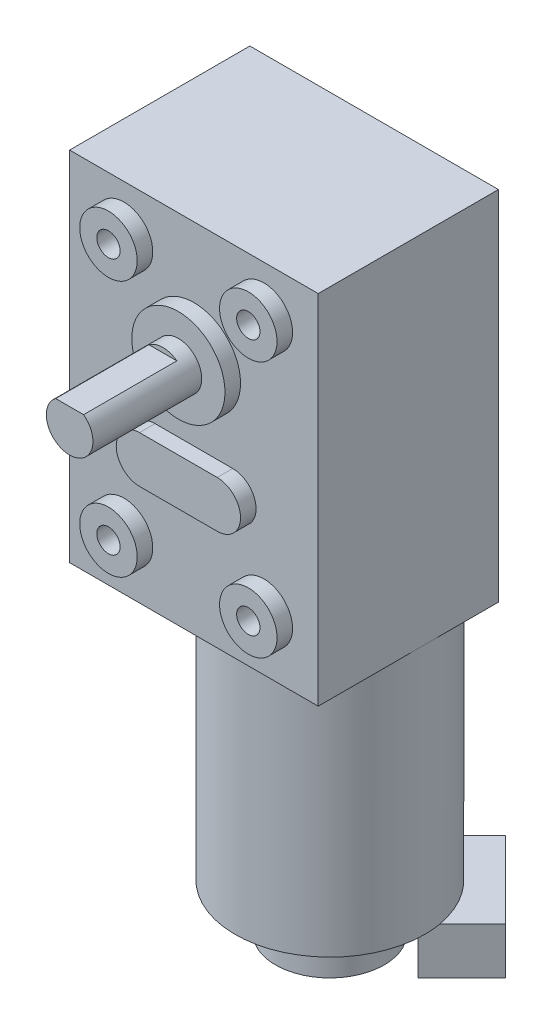
ISO-10303-21;
HEADER;
FILE_DESCRIPTION(('STEP AP214'),'2;1');
FILE_NAME('part.step','',(''),(''),'','','');
FILE_SCHEMA(('AUTOMOTIVE_DESIGN { 1 0 10303 214 1 1 1 1 }'));
ENDSEC;
DATA;
#1=APPLICATION_CONTEXT('core data for automotive mechanical design processes');
#2=APPLICATION_PROTOCOL_DEFINITION('international standard','automotive_design',2000,#1);
#3=PRODUCT_CONTEXT('',#1,'mechanical');
#4=PRODUCT('Part','Part','',(#3));
#5=PRODUCT_RELATED_PRODUCT_CATEGORY('part','',(#4));
#6=PRODUCT_DEFINITION_FORMATION('','',#4);
#7=PRODUCT_DEFINITION_CONTEXT('part definition',#1,'design');
#8=PRODUCT_DEFINITION('design','',#6,#7);
#9=PRODUCT_DEFINITION_SHAPE('','',#8);
#10=(LENGTH_UNIT() NAMED_UNIT(*) SI_UNIT(.MILLI.,.METRE.));
#11=(NAMED_UNIT(*) PLANE_ANGLE_UNIT() SI_UNIT($,.RADIAN.));
#12=(NAMED_UNIT(*) SI_UNIT($,.STERADIAN.) SOLID_ANGLE_UNIT());
#13=UNCERTAINTY_MEASURE_WITH_UNIT(LENGTH_MEASURE(1.E-05),#10,'distance_accuracy_value','');
#14=(GEOMETRIC_REPRESENTATION_CONTEXT(3) GLOBAL_UNCERTAINTY_ASSIGNED_CONTEXT((#13)) GLOBAL_UNIT_ASSIGNED_CONTEXT((#10,
#11,#12)) REPRESENTATION_CONTEXT('',''));
#15=CARTESIAN_POINT('',(0.,0.,0.));
#16=DIRECTION('',(0.,0.,1.));
#17=DIRECTION('',(1.,0.,0.));
#18=AXIS2_PLACEMENT_3D('',#15,#16,#17);
#19=CARTESIAN_POINT('',(3.80000000000001,-63.3,9.5));
#20=DIRECTION('',(0.,-1.,0.));
#21=DIRECTION('',(0.,0.,-1.));
#22=AXIS2_PLACEMENT_3D('',#19,#20,#21);
#23=PLANE('',#22);
#24=CARTESIAN_POINT('',(3.80000000000001,-63.3,9.5));
#25=DIRECTION('',(0.,-1.,0.));
#26=DIRECTION('',(0.,0.,-1.));
#27=AXIS2_PLACEMENT_3D('',#24,#25,#26);
#28=CIRCLE('',#27,7.);
#29=CARTESIAN_POINT('',(3.80000000000001,-63.3,2.5));
#30=VERTEX_POINT('',#29);
#31=EDGE_CURVE('E177',#30,#30,#28,.T.);
#32=ORIENTED_EDGE('',*,*,#31,.F.);
#33=EDGE_LOOP('',(#32));
#34=FACE_BOUND('',#33,.T.);
#35=CARTESIAN_POINT('',(3.80000000000001,-63.3,9.5));
#36=DIRECTION('',(0.,-1.,0.));
#37=DIRECTION('',(0.,0.,-1.));
#38=AXIS2_PLACEMENT_3D('',#35,#36,#37);
#39=CIRCLE('',#38,12.2);
#40=CARTESIAN_POINT('',(15.8151561613681,-63.3,7.38433877524353));
#41=VERTEX_POINT('',#40);
#42=CARTESIAN_POINT('',(5.91566122475643,-63.3,-2.51515616136811));
#43=VERTEX_POINT('',#42);
#44=EDGE_CURVE('E187',#41,#43,#39,.T.);
#45=ORIENTED_EDGE('',*,*,#44,.T.);
#46=DIRECTION('',(0.707106781186546,0.,-0.707106781186549));
#47=VECTOR('',#46,1.);
#48=CARTESIAN_POINT('',(4.50710678118654,-63.3,-1.10660171779822));
#49=LINE('',#48,#47);
#50=CARTESIAN_POINT('',(4.50710678118654,-63.3,-1.10660171779822));
#51=VERTEX_POINT('',#50);
#52=EDGE_CURVE('E793',#51,#43,#49,.T.);
#53=ORIENTED_EDGE('',*,*,#52,.F.);
#54=DIRECTION('',(-0.707106781186549,0.,-0.707106781186546));
#55=VECTOR('',#54,1.);
#56=CARTESIAN_POINT('',(14.4066017177982,-63.3,8.79289321881343));
#57=LINE('',#56,#55);
#58=CARTESIAN_POINT('',(14.4066017177982,-63.3,8.79289321881343));
#59=VERTEX_POINT('',#58);
#60=EDGE_CURVE('E175',#59,#51,#57,.T.);
#61=ORIENTED_EDGE('',*,*,#60,.F.);
#62=DIRECTION('',(0.707106781186546,0.,-0.707106781186549));
#63=VECTOR('',#62,1.);
#64=CARTESIAN_POINT('',(8.74974746830585,-63.3,14.4497474683058));
#65=LINE('',#64,#63);
#66=EDGE_CURVE('E11',#59,#41,#65,.T.);
#67=ORIENTED_EDGE('',*,*,#66,.T.);
#68=EDGE_LOOP('',(#45,#53,#61,#67));
#69=FACE_BOUND('',#68,.T.);
#70=ADVANCED_FACE('F34',(#34,#69),#23,.T.);
#71=CARTESIAN_POINT('',(0.,0.,23.2));
#72=DIRECTION('',(0.,0.,1.));
#73=DIRECTION('',(1.,0.,0.));
#74=AXIS2_PLACEMENT_3D('',#71,#72,#73);
#75=PLANE('',#74);
#76=CARTESIAN_POINT('',(0.,0.,23.2));
#77=DIRECTION('',(0.,0.,1.));
#78=DIRECTION('',(1.,0.,0.));
#79=AXIS2_PLACEMENT_3D('',#76,#77,#78);
#80=CIRCLE('',#79,6.);
#81=CARTESIAN_POINT('',(6.,0.,23.2));
#82=VERTEX_POINT('',#81);
#83=EDGE_CURVE('E261',#82,#82,#80,.T.);
#84=ORIENTED_EDGE('',*,*,#83,.F.);
#85=EDGE_LOOP('',(#84));
#86=FACE_BOUND('',#85,.T.);
#87=CARTESIAN_POINT('',(-8.99999999999999,-24.,23.2));
#88=DIRECTION('',(0.,0.,1.));
#89=DIRECTION('',(1.,0.,0.));
#90=AXIS2_PLACEMENT_3D('',#87,#88,#89);
#91=CIRCLE('',#90,3.7);
#92=CARTESIAN_POINT('',(-5.29999999999999,-24.,23.2));
#93=VERTEX_POINT('',#92);
#94=EDGE_CURVE('E265',#93,#93,#91,.T.);
#95=ORIENTED_EDGE('',*,*,#94,.F.);
#96=EDGE_LOOP('',(#95));
#97=FACE_BOUND('',#96,.T.);
#98=CARTESIAN_POINT('',(9.00000000000001,-24.,23.2));
#99=DIRECTION('',(0.,0.,1.));
#100=DIRECTION('',(1.,0.,0.));
#101=AXIS2_PLACEMENT_3D('',#98,#99,#100);
#102=CIRCLE('',#101,3.7);
#103=CARTESIAN_POINT('',(12.7,-24.,23.2));
#104=VERTEX_POINT('',#103);
#105=EDGE_CURVE('E271',#104,#104,#102,.T.);
#106=ORIENTED_EDGE('',*,*,#105,.F.);
#107=EDGE_LOOP('',(#106));
#108=FACE_BOUND('',#107,.T.);
#109=CARTESIAN_POINT('',(9.,9.,23.2));
#110=DIRECTION('',(0.,0.,1.));
#111=DIRECTION('',(1.,0.,0.));
#112=AXIS2_PLACEMENT_3D('',#109,#110,#111);
#113=CIRCLE('',#112,3.7);
#114=CARTESIAN_POINT('',(12.7,9.,23.2));
#115=VERTEX_POINT('',#114);
#116=EDGE_CURVE('E277',#115,#115,#113,.T.);
#117=ORIENTED_EDGE('',*,*,#116,.F.);
#118=EDGE_LOOP('',(#117));
#119=FACE_BOUND('',#118,.T.);
#120=CARTESIAN_POINT('',(-9.,9.,23.2));
#121=DIRECTION('',(0.,0.,1.));
#122=DIRECTION('',(1.,0.,0.));
#123=AXIS2_PLACEMENT_3D('',#120,#121,#122);
#124=CIRCLE('',#123,3.7);
#125=CARTESIAN_POINT('',(-5.3,9.,23.2));
#126=VERTEX_POINT('',#125);
#127=EDGE_CURVE('E283',#126,#126,#124,.T.);
#128=ORIENTED_EDGE('',*,*,#127,.F.);
#129=EDGE_LOOP('',(#128));
#130=FACE_BOUND('',#129,.T.);
#131=DIRECTION('',(0.,-1.,0.));
#132=VECTOR('',#131,1.);
#133=CARTESIAN_POINT('',(-16.,15.,23.2));
#134=LINE('',#133,#132);
#135=CARTESIAN_POINT('',(-16.,15.,23.2));
#136=VERTEX_POINT('',#135);
#137=CARTESIAN_POINT('',(-16.,-31.,23.2));
#138=VERTEX_POINT('',#137);
#139=EDGE_CURVE('E296',#136,#138,#134,.T.);
#140=ORIENTED_EDGE('',*,*,#139,.T.);
#141=DIRECTION('',(1.,0.,0.));
#142=VECTOR('',#141,1.);
#143=CARTESIAN_POINT('',(-16.,-31.,23.2));
#144=LINE('',#143,#142);
#145=CARTESIAN_POINT('',(16.,-31.,23.2));
#146=VERTEX_POINT('',#145);
#147=EDGE_CURVE('E299',#138,#146,#144,.T.);
#148=ORIENTED_EDGE('',*,*,#147,.T.);
#149=DIRECTION('',(0.,1.,0.));
#150=VECTOR('',#149,1.);
#151=CARTESIAN_POINT('',(16.,15.,23.2));
#152=LINE('',#151,#150);
#153=CARTESIAN_POINT('',(16.,15.,23.2));
#154=VERTEX_POINT('',#153);
#155=EDGE_CURVE('E302',#146,#154,#152,.T.);
#156=ORIENTED_EDGE('',*,*,#155,.T.);
#157=DIRECTION('',(-1.,0.,0.));
#158=VECTOR('',#157,1.);
#159=CARTESIAN_POINT('',(-16.,15.,23.2));
#160=LINE('',#159,#158);
#161=EDGE_CURVE('E304',#154,#136,#160,.T.);
#162=ORIENTED_EDGE('',*,*,#161,.T.);
#163=EDGE_LOOP('',(#140,#148,#156,#162));
#164=FACE_BOUND('',#163,.T.);
#165=DIRECTION('',(1.,0.,0.));
#166=VECTOR('',#165,1.);
#167=CARTESIAN_POINT('',(-5.00000000000001,-16.,23.2));
#168=LINE('',#167,#166);
#169=CARTESIAN_POINT('',(-5.00000000000001,-16.,23.2));
#170=VERTEX_POINT('',#169);
#171=CARTESIAN_POINT('',(4.99999999999999,-16.,23.2));
#172=VERTEX_POINT('',#171);
#173=EDGE_CURVE('E246',#170,#172,#168,.T.);
#174=ORIENTED_EDGE('',*,*,#173,.F.);
#175=CARTESIAN_POINT('',(-5.00000000000001,-13.,23.2));
#176=DIRECTION('',(0.,0.,1.));
#177=DIRECTION('',(1.,0.,0.));
#178=AXIS2_PLACEMENT_3D('',#175,#176,#177);
#179=CIRCLE('',#178,3.);
#180=CARTESIAN_POINT('',(-5.00000000000001,-10.,23.2));
#181=VERTEX_POINT('',#180);
#182=EDGE_CURVE('E230',#181,#170,#179,.T.);
#183=ORIENTED_EDGE('',*,*,#182,.F.);
#184=DIRECTION('',(-1.,0.,0.));
#185=VECTOR('',#184,1.);
#186=CARTESIAN_POINT('',(-5.00000000000001,-10.,23.2));
#187=LINE('',#186,#185);
#188=CARTESIAN_POINT('',(4.99999999999999,-10.,23.2));
#189=VERTEX_POINT('',#188);
#190=EDGE_CURVE('E237',#189,#181,#187,.T.);
#191=ORIENTED_EDGE('',*,*,#190,.F.);
#192=CARTESIAN_POINT('',(4.99999999999999,-13.,23.2));
#193=DIRECTION('',(0.,0.,1.));
#194=DIRECTION('',(1.,0.,0.));
#195=AXIS2_PLACEMENT_3D('',#192,#193,#194);
#196=CIRCLE('',#195,3.);
#197=EDGE_CURVE('E248',#172,#189,#196,.T.);
#198=ORIENTED_EDGE('',*,*,#197,.F.);
#199=EDGE_LOOP('',(#174,#183,#191,#198));
#200=FACE_BOUND('',#199,.T.);
#201=ADVANCED_FACE('F358',(#86,#97,#108,#119,#130,#164,#200),#75,.T.);
#202=CARTESIAN_POINT('',(-16.,-31.,23.2));
#203=DIRECTION('',(0.,1.,0.));
#204=DIRECTION('',(0.,0.,1.));
#205=AXIS2_PLACEMENT_3D('',#202,#203,#204);
#206=PLANE('',#205);
#207=CARTESIAN_POINT('',(3.80000000000001,-31.,9.5));
#208=DIRECTION('',(0.,-1.,0.));
#209=DIRECTION('',(0.,0.,-1.));
#210=AXIS2_PLACEMENT_3D('',#207,#208,#209);
#211=CIRCLE('',#210,12.2);
#212=CARTESIAN_POINT('',(11.4544104933039,-31.,0.));
#213=VERTEX_POINT('',#212);
#214=CARTESIAN_POINT('',(16.,-31.,9.5));
#215=VERTEX_POINT('',#214);
#216=EDGE_CURVE('E292',#213,#215,#211,.T.);
#217=ORIENTED_EDGE('',*,*,#216,.F.);
#218=DIRECTION('',(1.,0.,0.));
#219=VECTOR('',#218,1.);
#220=CARTESIAN_POINT('',(-16.,-31.,0.));
#221=LINE('',#220,#219);
#222=CARTESIAN_POINT('',(16.,-31.,0.));
#223=VERTEX_POINT('',#222);
#224=EDGE_CURVE('E309',#213,#223,#221,.T.);
#225=ORIENTED_EDGE('',*,*,#224,.T.);
#226=DIRECTION('',(0.,0.,-1.));
#227=VECTOR('',#226,1.);
#228=CARTESIAN_POINT('',(16.,-31.,23.2));
#229=LINE('',#228,#227);
#230=EDGE_CURVE('E321',#215,#223,#229,.T.);
#231=ORIENTED_EDGE('',*,*,#230,.F.);
#232=EDGE_LOOP('',(#217,#225,#231));
#233=FACE_BOUND('',#232,.T.);
#234=ADVANCED_FACE('F344',(#233),#206,.F.);
#235=CARTESIAN_POINT('',(-16.,15.,23.2));
#236=DIRECTION('',(1.,0.,0.));
#237=DIRECTION('',(0.,0.,-1.));
#238=AXIS2_PLACEMENT_3D('',#235,#236,#237);
#239=PLANE('',#238);
#240=DIRECTION('',(0.,-1.,0.));
#241=VECTOR('',#240,1.);
#242=CARTESIAN_POINT('',(-16.,15.,0.));
#243=LINE('',#242,#241);
#244=CARTESIAN_POINT('',(-16.,15.,0.));
#245=VERTEX_POINT('',#244);
#246=CARTESIAN_POINT('',(-16.,-31.,0.));
#247=VERTEX_POINT('',#246);
#248=EDGE_CURVE('E295',#245,#247,#243,.T.);
#249=ORIENTED_EDGE('',*,*,#248,.T.);
#250=DIRECTION('',(0.,0.,-1.));
#251=VECTOR('',#250,1.);
#252=CARTESIAN_POINT('',(-16.,-31.,23.2));
#253=LINE('',#252,#251);
#254=EDGE_CURVE('E324',#138,#247,#253,.T.);
#255=ORIENTED_EDGE('',*,*,#254,.F.);
#256=ORIENTED_EDGE('',*,*,#139,.F.);
#257=DIRECTION('',(0.,0.,-1.));
#258=VECTOR('',#257,1.);
#259=CARTESIAN_POINT('',(-16.,15.,23.2));
#260=LINE('',#259,#258);
#261=EDGE_CURVE('E306',#136,#245,#260,.T.);
#262=ORIENTED_EDGE('',*,*,#261,.T.);
#263=EDGE_LOOP('',(#249,#255,#256,#262));
#264=FACE_BOUND('',#263,.T.);
#265=ADVANCED_FACE('F36',(#264),#239,.F.);
#266=CARTESIAN_POINT('',(-3.85441049330383,-31.,0.));
#267=VERTEX_POINT('',#266);
#268=EDGE_CURVE('E42',#215,#267,#211,.T.);
#269=ORIENTED_EDGE('',*,*,#268,.F.);
#270=EDGE_CURVE('E322',#146,#215,#229,.T.);
#271=ORIENTED_EDGE('',*,*,#270,.F.);
#272=ORIENTED_EDGE('',*,*,#147,.F.);
#273=ORIENTED_EDGE('',*,*,#254,.T.);
#274=EDGE_CURVE('E310',#247,#267,#221,.T.);
#275=ORIENTED_EDGE('',*,*,#274,.T.);
#276=EDGE_LOOP('',(#269,#271,#272,#273,#275));
#277=FACE_BOUND('',#276,.T.);
#278=ADVANCED_FACE('F361',(#277),#206,.F.);
#279=CARTESIAN_POINT('',(16.,15.,23.2));
#280=DIRECTION('',(-1.,0.,0.));
#281=DIRECTION('',(0.,-1.,0.));
#282=AXIS2_PLACEMENT_3D('',#279,#280,#281);
#283=PLANE('',#282);
#284=DIRECTION('',(0.,1.,0.));
#285=VECTOR('',#284,1.);
#286=CARTESIAN_POINT('',(16.,15.,0.));
#287=LINE('',#286,#285);
#288=CARTESIAN_POINT('',(16.,15.,0.));
#289=VERTEX_POINT('',#288);
#290=EDGE_CURVE('E312',#223,#289,#287,.T.);
#291=ORIENTED_EDGE('',*,*,#290,.T.);
#292=DIRECTION('',(0.,0.,-1.));
#293=VECTOR('',#292,1.);
#294=CARTESIAN_POINT('',(16.,15.,23.2));
#295=LINE('',#294,#293);
#296=EDGE_CURVE('E318',#154,#289,#295,.T.);
#297=ORIENTED_EDGE('',*,*,#296,.F.);
#298=ORIENTED_EDGE('',*,*,#155,.F.);
#299=ORIENTED_EDGE('',*,*,#270,.T.);
#300=ORIENTED_EDGE('',*,*,#230,.T.);
#301=EDGE_LOOP('',(#291,#297,#298,#299,#300));
#302=FACE_BOUND('',#301,.T.);
#303=ADVANCED_FACE('F350',(#302),#283,.F.);
#304=CARTESIAN_POINT('',(-16.,15.,23.2));
#305=DIRECTION('',(0.,-1.,0.));
#306=DIRECTION('',(1.,0.,0.));
#307=AXIS2_PLACEMENT_3D('',#304,#305,#306);
#308=PLANE('',#307);
#309=DIRECTION('',(-1.,0.,0.));
#310=VECTOR('',#309,1.);
#311=CARTESIAN_POINT('',(-16.,15.,0.));
#312=LINE('',#311,#310);
#313=EDGE_CURVE('E300',#289,#245,#312,.T.);
#314=ORIENTED_EDGE('',*,*,#313,.T.);
#315=ORIENTED_EDGE('',*,*,#261,.F.);
#316=ORIENTED_EDGE('',*,*,#161,.F.);
#317=ORIENTED_EDGE('',*,*,#296,.T.);
#318=EDGE_LOOP('',(#314,#315,#316,#317));
#319=FACE_BOUND('',#318,.T.);
#320=ADVANCED_FACE('F354',(#319),#308,.F.);
#321=CARTESIAN_POINT('',(0.,0.,0.));
#322=DIRECTION('',(0.,0.,1.));
#323=DIRECTION('',(1.,0.,0.));
#324=AXIS2_PLACEMENT_3D('',#321,#322,#323);
#325=PLANE('',#324);
#326=ORIENTED_EDGE('',*,*,#248,.F.);
#327=ORIENTED_EDGE('',*,*,#313,.F.);
#328=ORIENTED_EDGE('',*,*,#290,.F.);
#329=ORIENTED_EDGE('',*,*,#224,.F.);
#330=EDGE_CURVE('E313',#267,#213,#221,.T.);
#331=ORIENTED_EDGE('',*,*,#330,.F.);
#332=ORIENTED_EDGE('',*,*,#274,.F.);
#333=EDGE_LOOP('',(#326,#327,#328,#329,#331,#332));
#334=FACE_BOUND('',#333,.T.);
#335=ADVANCED_FACE('F347',(#334),#325,.F.);
#336=CARTESIAN_POINT('',(3.80000000000001,-31.,9.5));
#337=DIRECTION('',(0.,-1.,0.));
#338=DIRECTION('',(0.,0.,-1.));
#339=AXIS2_PLACEMENT_3D('',#336,#337,#338);
#340=PLANE('',#339);
#341=EDGE_CURVE('E289',#267,#213,#211,.T.);
#342=ORIENTED_EDGE('',*,*,#341,.F.);
#343=ORIENTED_EDGE('',*,*,#330,.T.);
#344=EDGE_LOOP('',(#342,#343));
#345=FACE_BOUND('',#344,.T.);
#346=ADVANCED_FACE('F336',(#345),#340,.F.);
#347=CARTESIAN_POINT('',(3.80000000000001,-61.8,9.5));
#348=DIRECTION('',(0.,1.,0.));
#349=DIRECTION('',(0.,0.,1.));
#350=AXIS2_PLACEMENT_3D('',#347,#348,#349);
#351=CYLINDRICAL_SURFACE('',#350,12.2);
#352=ORIENTED_EDGE('',*,*,#216,.T.);
#353=ORIENTED_EDGE('',*,*,#268,.T.);
#354=ORIENTED_EDGE('',*,*,#341,.T.);
#355=EDGE_LOOP('',(#352,#353,#354));
#356=FACE_BOUND('',#355,.T.);
#357=EDGE_CURVE('E189',#43,#41,#39,.T.);
#358=ORIENTED_EDGE('',*,*,#357,.F.);
#359=ORIENTED_EDGE('',*,*,#44,.F.);
#360=EDGE_LOOP('',(#358,#359));
#361=FACE_BOUND('',#360,.T.);
#362=ADVANCED_FACE('F332',(#356,#361),#351,.T.);
#363=CARTESIAN_POINT('',(-9.,9.,25.2));
#364=DIRECTION('',(0.,0.,-1.));
#365=DIRECTION('',(-1.,0.,0.));
#366=AXIS2_PLACEMENT_3D('',#363,#364,#365);
#367=CYLINDRICAL_SURFACE('',#366,3.7);
#368=CARTESIAN_POINT('',(-9.,9.,25.2));
#369=DIRECTION('',(0.,0.,1.));
#370=DIRECTION('',(1.,0.,0.));
#371=AXIS2_PLACEMENT_3D('',#368,#369,#370);
#372=CIRCLE('',#371,3.7);
#373=CARTESIAN_POINT('',(-5.3,9.,25.2));
#374=VERTEX_POINT('',#373);
#375=EDGE_CURVE('E286',#374,#374,#372,.T.);
#376=ORIENTED_EDGE('',*,*,#375,.F.);
#377=EDGE_LOOP('',(#376));
#378=FACE_BOUND('',#377,.T.);
#379=ORIENTED_EDGE('',*,*,#127,.T.);
#380=EDGE_LOOP('',(#379));
#381=FACE_BOUND('',#380,.T.);
#382=ADVANCED_FACE('F484',(#378,#381),#367,.T.);
#383=CARTESIAN_POINT('',(-9.,9.,25.2));
#384=DIRECTION('',(0.,0.,1.));
#385=DIRECTION('',(1.,0.,0.));
#386=AXIS2_PLACEMENT_3D('',#383,#384,#385);
#387=PLANE('',#386);
#388=CARTESIAN_POINT('',(-9.,9.,25.2));
#389=DIRECTION('',(0.,0.,1.));
#390=DIRECTION('',(1.,0.,0.));
#391=AXIS2_PLACEMENT_3D('',#388,#389,#390);
#392=CIRCLE('',#391,1.5);
#393=CARTESIAN_POINT('',(-7.5,9.,25.2));
#394=VERTEX_POINT('',#393);
#395=EDGE_CURVE('E202',#394,#394,#392,.T.);
#396=ORIENTED_EDGE('',*,*,#395,.F.);
#397=EDGE_LOOP('',(#396));
#398=FACE_BOUND('',#397,.T.);
#399=ORIENTED_EDGE('',*,*,#375,.T.);
#400=EDGE_LOOP('',(#399));
#401=FACE_BOUND('',#400,.T.);
#402=ADVANCED_FACE('F480',(#398,#401),#387,.T.);
#403=CARTESIAN_POINT('',(9.,9.,25.2));
#404=DIRECTION('',(0.,0.,-1.));
#405=DIRECTION('',(-1.,0.,0.));
#406=AXIS2_PLACEMENT_3D('',#403,#404,#405);
#407=CYLINDRICAL_SURFACE('',#406,3.7);
#408=CARTESIAN_POINT('',(9.,9.,25.2));
#409=DIRECTION('',(0.,0.,1.));
#410=DIRECTION('',(1.,0.,0.));
#411=AXIS2_PLACEMENT_3D('',#408,#409,#410);
#412=CIRCLE('',#411,3.7);
#413=CARTESIAN_POINT('',(12.7,9.,25.2));
#414=VERTEX_POINT('',#413);
#415=EDGE_CURVE('E280',#414,#414,#412,.T.);
#416=ORIENTED_EDGE('',*,*,#415,.F.);
#417=EDGE_LOOP('',(#416));
#418=FACE_BOUND('',#417,.T.);
#419=ORIENTED_EDGE('',*,*,#116,.T.);
#420=EDGE_LOOP('',(#419));
#421=FACE_BOUND('',#420,.T.);
#422=ADVANCED_FACE('F476',(#418,#421),#407,.T.);
#423=CARTESIAN_POINT('',(9.,9.,25.2));
#424=DIRECTION('',(0.,0.,1.));
#425=DIRECTION('',(1.,0.,0.));
#426=AXIS2_PLACEMENT_3D('',#423,#424,#425);
#427=PLANE('',#426);
#428=CARTESIAN_POINT('',(9.,9.,25.2));
#429=DIRECTION('',(0.,0.,1.));
#430=DIRECTION('',(1.,0.,0.));
#431=AXIS2_PLACEMENT_3D('',#428,#429,#430);
#432=CIRCLE('',#431,1.5);
#433=CARTESIAN_POINT('',(10.5,9.,25.2));
#434=VERTEX_POINT('',#433);
#435=EDGE_CURVE('E195',#434,#434,#432,.T.);
#436=ORIENTED_EDGE('',*,*,#435,.F.);
#437=EDGE_LOOP('',(#436));
#438=FACE_BOUND('',#437,.T.);
#439=ORIENTED_EDGE('',*,*,#415,.T.);
#440=EDGE_LOOP('',(#439));
#441=FACE_BOUND('',#440,.T.);
#442=ADVANCED_FACE('F472',(#438,#441),#427,.T.);
#443=CARTESIAN_POINT('',(9.00000000000001,-24.,25.2));
#444=DIRECTION('',(0.,0.,-1.));
#445=DIRECTION('',(-1.,0.,0.));
#446=AXIS2_PLACEMENT_3D('',#443,#444,#445);
#447=CYLINDRICAL_SURFACE('',#446,3.7);
#448=CARTESIAN_POINT('',(9.00000000000001,-24.,25.2));
#449=DIRECTION('',(0.,0.,1.));
#450=DIRECTION('',(1.,0.,0.));
#451=AXIS2_PLACEMENT_3D('',#448,#449,#450);
#452=CIRCLE('',#451,3.7);
#453=CARTESIAN_POINT('',(12.7,-24.,25.2));
#454=VERTEX_POINT('',#453);
#455=EDGE_CURVE('E274',#454,#454,#452,.T.);
#456=ORIENTED_EDGE('',*,*,#455,.F.);
#457=EDGE_LOOP('',(#456));
#458=FACE_BOUND('',#457,.T.);
#459=ORIENTED_EDGE('',*,*,#105,.T.);
#460=EDGE_LOOP('',(#459));
#461=FACE_BOUND('',#460,.T.);
#462=ADVANCED_FACE('F468',(#458,#461),#447,.T.);
#463=CARTESIAN_POINT('',(9.00000000000001,-24.,25.2));
#464=DIRECTION('',(0.,0.,1.));
#465=DIRECTION('',(1.,0.,0.));
#466=AXIS2_PLACEMENT_3D('',#463,#464,#465);
#467=PLANE('',#466);
#468=CARTESIAN_POINT('',(9.00000000000001,-24.,25.2));
#469=DIRECTION('',(0.,0.,1.));
#470=DIRECTION('',(1.,0.,0.));
#471=AXIS2_PLACEMENT_3D('',#468,#469,#470);
#472=CIRCLE('',#471,1.5);
#473=CARTESIAN_POINT('',(10.5,-24.,25.2));
#474=VERTEX_POINT('',#473);
#475=EDGE_CURVE('E196',#474,#474,#472,.T.);
#476=ORIENTED_EDGE('',*,*,#475,.F.);
#477=EDGE_LOOP('',(#476));
#478=FACE_BOUND('',#477,.T.);
#479=ORIENTED_EDGE('',*,*,#455,.T.);
#480=EDGE_LOOP('',(#479));
#481=FACE_BOUND('',#480,.T.);
#482=ADVANCED_FACE('F464',(#478,#481),#467,.T.);
#483=CARTESIAN_POINT('',(-8.99999999999999,-24.,25.2));
#484=DIRECTION('',(0.,0.,-1.));
#485=DIRECTION('',(-1.,0.,0.));
#486=AXIS2_PLACEMENT_3D('',#483,#484,#485);
#487=CYLINDRICAL_SURFACE('',#486,3.7);
#488=CARTESIAN_POINT('',(-8.99999999999999,-24.,25.2));
#489=DIRECTION('',(0.,0.,1.));
#490=DIRECTION('',(1.,0.,0.));
#491=AXIS2_PLACEMENT_3D('',#488,#489,#490);
#492=CIRCLE('',#491,3.7);
#493=CARTESIAN_POINT('',(-5.29999999999999,-24.,25.2));
#494=VERTEX_POINT('',#493);
#495=EDGE_CURVE('E268',#494,#494,#492,.T.);
#496=ORIENTED_EDGE('',*,*,#495,.F.);
#497=EDGE_LOOP('',(#496));
#498=FACE_BOUND('',#497,.T.);
#499=ORIENTED_EDGE('',*,*,#94,.T.);
#500=EDGE_LOOP('',(#499));
#501=FACE_BOUND('',#500,.T.);
#502=ADVANCED_FACE('F460',(#498,#501),#487,.T.);
#503=CARTESIAN_POINT('',(-8.99999999999999,-24.,25.2));
#504=DIRECTION('',(0.,0.,1.));
#505=DIRECTION('',(1.,0.,0.));
#506=AXIS2_PLACEMENT_3D('',#503,#504,#505);
#507=PLANE('',#506);
#508=CARTESIAN_POINT('',(-8.99999999999999,-24.,25.2));
#509=DIRECTION('',(0.,0.,1.));
#510=DIRECTION('',(1.,0.,0.));
#511=AXIS2_PLACEMENT_3D('',#508,#509,#510);
#512=CIRCLE('',#511,1.5);
#513=CARTESIAN_POINT('',(-7.49999999999999,-24.,25.2));
#514=VERTEX_POINT('',#513);
#515=EDGE_CURVE('E191',#514,#514,#512,.T.);
#516=ORIENTED_EDGE('',*,*,#515,.F.);
#517=EDGE_LOOP('',(#516));
#518=FACE_BOUND('',#517,.T.);
#519=ORIENTED_EDGE('',*,*,#495,.T.);
#520=EDGE_LOOP('',(#519));
#521=FACE_BOUND('',#520,.T.);
#522=ADVANCED_FACE('F456',(#518,#521),#507,.T.);
#523=CARTESIAN_POINT('',(0.,0.,25.2));
#524=DIRECTION('',(0.,0.,-1.));
#525=DIRECTION('',(-1.,0.,0.));
#526=AXIS2_PLACEMENT_3D('',#523,#524,#525);
#527=CYLINDRICAL_SURFACE('',#526,6.);
#528=CARTESIAN_POINT('',(0.,0.,25.2));
#529=DIRECTION('',(0.,0.,1.));
#530=DIRECTION('',(1.,0.,0.));
#531=AXIS2_PLACEMENT_3D('',#528,#529,#530);
#532=CIRCLE('',#531,6.);
#533=CARTESIAN_POINT('',(6.,0.,25.2));
#534=VERTEX_POINT('',#533);
#535=EDGE_CURVE('E262',#534,#534,#532,.T.);
#536=ORIENTED_EDGE('',*,*,#535,.F.);
#537=EDGE_LOOP('',(#536));
#538=FACE_BOUND('',#537,.T.);
#539=ORIENTED_EDGE('',*,*,#83,.T.);
#540=EDGE_LOOP('',(#539));
#541=FACE_BOUND('',#540,.T.);
#542=ADVANCED_FACE('F452',(#538,#541),#527,.T.);
#543=CARTESIAN_POINT('',(0.,0.,25.2));
#544=DIRECTION('',(0.,0.,1.));
#545=DIRECTION('',(1.,0.,0.));
#546=AXIS2_PLACEMENT_3D('',#543,#544,#545);
#547=PLANE('',#546);
#548=CARTESIAN_POINT('',(0.,0.,25.2));
#549=DIRECTION('',(0.,0.,1.));
#550=DIRECTION('',(1.,0.,0.));
#551=AXIS2_PLACEMENT_3D('',#548,#549,#550);
#552=CIRCLE('',#551,3.);
#553=CARTESIAN_POINT('',(3.,0.,25.2));
#554=VERTEX_POINT('',#553);
#555=EDGE_CURVE('E225',#554,#554,#552,.T.);
#556=ORIENTED_EDGE('',*,*,#555,.F.);
#557=EDGE_LOOP('',(#556));
#558=FACE_BOUND('',#557,.T.);
#559=ORIENTED_EDGE('',*,*,#535,.T.);
#560=EDGE_LOOP('',(#559));
#561=FACE_BOUND('',#560,.T.);
#562=ADVANCED_FACE('F448',(#558,#561),#547,.T.);
#563=CARTESIAN_POINT('',(-5.00000000000001,-13.,25.2));
#564=DIRECTION('',(0.,0.,-1.));
#565=DIRECTION('',(-1.,0.,0.));
#566=AXIS2_PLACEMENT_3D('',#563,#564,#565);
#567=CYLINDRICAL_SURFACE('',#566,3.);
#568=ORIENTED_EDGE('',*,*,#182,.T.);
#569=DIRECTION('',(0.,0.,-1.));
#570=VECTOR('',#569,1.);
#571=CARTESIAN_POINT('',(-5.00000000000001,-16.,25.2));
#572=LINE('',#571,#570);
#573=CARTESIAN_POINT('',(-5.00000000000001,-16.,25.2));
#574=VERTEX_POINT('',#573);
#575=EDGE_CURVE('E259',#574,#170,#572,.T.);
#576=ORIENTED_EDGE('',*,*,#575,.F.);
#577=CARTESIAN_POINT('',(-5.00000000000001,-13.,25.2));
#578=DIRECTION('',(0.,0.,1.));
#579=DIRECTION('',(1.,0.,0.));
#580=AXIS2_PLACEMENT_3D('',#577,#578,#579);
#581=CIRCLE('',#580,3.);
#582=CARTESIAN_POINT('',(-5.00000000000001,-10.,25.2));
#583=VERTEX_POINT('',#582);
#584=EDGE_CURVE('E233',#583,#574,#581,.T.);
#585=ORIENTED_EDGE('',*,*,#584,.F.);
#586=DIRECTION('',(0.,0.,-1.));
#587=VECTOR('',#586,1.);
#588=CARTESIAN_POINT('',(-5.00000000000001,-10.,25.2));
#589=LINE('',#588,#587);
#590=EDGE_CURVE('E243',#583,#181,#589,.T.);
#591=ORIENTED_EDGE('',*,*,#590,.T.);
#592=EDGE_LOOP('',(#568,#576,#585,#591));
#593=FACE_BOUND('',#592,.T.);
#594=ADVANCED_FACE('F444',(#593),#567,.T.);
#595=CARTESIAN_POINT('',(-5.00000000000001,-16.,25.2));
#596=DIRECTION('',(0.,1.,0.));
#597=DIRECTION('',(0.,0.,1.));
#598=AXIS2_PLACEMENT_3D('',#595,#596,#597);
#599=PLANE('',#598);
#600=ORIENTED_EDGE('',*,*,#173,.T.);
#601=DIRECTION('',(0.,0.,-1.));
#602=VECTOR('',#601,1.);
#603=CARTESIAN_POINT('',(4.99999999999999,-16.,25.2));
#604=LINE('',#603,#602);
#605=CARTESIAN_POINT('',(4.99999999999999,-16.,25.2));
#606=VERTEX_POINT('',#605);
#607=EDGE_CURVE('E256',#606,#172,#604,.T.);
#608=ORIENTED_EDGE('',*,*,#607,.F.);
#609=DIRECTION('',(1.,0.,0.));
#610=VECTOR('',#609,1.);
#611=CARTESIAN_POINT('',(-5.00000000000001,-16.,25.2));
#612=LINE('',#611,#610);
#613=EDGE_CURVE('E236',#574,#606,#612,.T.);
#614=ORIENTED_EDGE('',*,*,#613,.F.);
#615=ORIENTED_EDGE('',*,*,#575,.T.);
#616=EDGE_LOOP('',(#600,#608,#614,#615));
#617=FACE_BOUND('',#616,.T.);
#618=ADVANCED_FACE('F440',(#617),#599,.F.);
#619=CARTESIAN_POINT('',(4.99999999999999,-13.,25.2));
#620=DIRECTION('',(0.,0.,-1.));
#621=DIRECTION('',(-1.,0.,0.));
#622=AXIS2_PLACEMENT_3D('',#619,#620,#621);
#623=CYLINDRICAL_SURFACE('',#622,3.);
#624=ORIENTED_EDGE('',*,*,#197,.T.);
#625=DIRECTION('',(0.,0.,-1.));
#626=VECTOR('',#625,1.);
#627=CARTESIAN_POINT('',(4.99999999999999,-10.,25.2));
#628=LINE('',#627,#626);
#629=CARTESIAN_POINT('',(4.99999999999999,-10.,25.2));
#630=VERTEX_POINT('',#629);
#631=EDGE_CURVE('E254',#630,#189,#628,.T.);
#632=ORIENTED_EDGE('',*,*,#631,.F.);
#633=CARTESIAN_POINT('',(4.99999999999999,-13.,25.2));
#634=DIRECTION('',(0.,0.,1.));
#635=DIRECTION('',(1.,0.,0.));
#636=AXIS2_PLACEMENT_3D('',#633,#634,#635);
#637=CIRCLE('',#636,3.);
#638=EDGE_CURVE('E239',#606,#630,#637,.T.);
#639=ORIENTED_EDGE('',*,*,#638,.F.);
#640=ORIENTED_EDGE('',*,*,#607,.T.);
#641=EDGE_LOOP('',(#624,#632,#639,#640));
#642=FACE_BOUND('',#641,.T.);
#643=ADVANCED_FACE('F436',(#642),#623,.T.);
#644=CARTESIAN_POINT('',(-5.00000000000001,-10.,25.2));
#645=DIRECTION('',(0.,-1.,0.));
#646=DIRECTION('',(0.,0.,-1.));
#647=AXIS2_PLACEMENT_3D('',#644,#645,#646);
#648=PLANE('',#647);
#649=ORIENTED_EDGE('',*,*,#190,.T.);
#650=ORIENTED_EDGE('',*,*,#590,.F.);
#651=DIRECTION('',(-1.,0.,0.));
#652=VECTOR('',#651,1.);
#653=CARTESIAN_POINT('',(-5.00000000000001,-10.,25.2));
#654=LINE('',#653,#652);
#655=EDGE_CURVE('E241',#630,#583,#654,.T.);
#656=ORIENTED_EDGE('',*,*,#655,.F.);
#657=ORIENTED_EDGE('',*,*,#631,.T.);
#658=EDGE_LOOP('',(#649,#650,#656,#657));
#659=FACE_BOUND('',#658,.T.);
#660=ADVANCED_FACE('F432',(#659),#648,.F.);
#661=CARTESIAN_POINT('',(-5.00000000000001,-13.,25.2));
#662=DIRECTION('',(0.,0.,1.));
#663=DIRECTION('',(1.,0.,0.));
#664=AXIS2_PLACEMENT_3D('',#661,#662,#663);
#665=PLANE('',#664);
#666=ORIENTED_EDGE('',*,*,#584,.T.);
#667=ORIENTED_EDGE('',*,*,#613,.T.);
#668=ORIENTED_EDGE('',*,*,#638,.T.);
#669=ORIENTED_EDGE('',*,*,#655,.T.);
#670=EDGE_LOOP('',(#666,#667,#668,#669));
#671=FACE_BOUND('',#670,.T.);
#672=ADVANCED_FACE('F428',(#671),#665,.T.);
#673=CARTESIAN_POINT('',(0.,0.,39.2));
#674=DIRECTION('',(0.,0.,-1.));
#675=DIRECTION('',(-1.,0.,0.));
#676=AXIS2_PLACEMENT_3D('',#673,#674,#675);
#677=CYLINDRICAL_SURFACE('',#676,3.);
#678=CARTESIAN_POINT('',(0.,0.,39.2));
#679=DIRECTION('',(0.,0.,1.));
#680=DIRECTION('',(1.,0.,0.));
#681=AXIS2_PLACEMENT_3D('',#678,#679,#680);
#682=CIRCLE('',#681,3.);
#683=CARTESIAN_POINT('',(-1.8,2.4,39.2));
#684=VERTEX_POINT('',#683);
#685=CARTESIAN_POINT('',(1.8,2.4,39.2));
#686=VERTEX_POINT('',#685);
#687=EDGE_CURVE('E227',#684,#686,#682,.T.);
#688=ORIENTED_EDGE('',*,*,#687,.F.);
#689=DIRECTION('',(0.,0.,1.));
#690=VECTOR('',#689,1.);
#691=CARTESIAN_POINT('',(-1.8,2.4,27.2));
#692=LINE('',#691,#690);
#693=CARTESIAN_POINT('',(-1.8,2.4,27.2));
#694=VERTEX_POINT('',#693);
#695=EDGE_CURVE('E57',#694,#684,#692,.T.);
#696=ORIENTED_EDGE('',*,*,#695,.F.);
#697=CARTESIAN_POINT('',(0.,0.,27.2));
#698=DIRECTION('',(0.,0.,1.));
#699=DIRECTION('',(-1.,0.,0.));
#700=AXIS2_PLACEMENT_3D('',#697,#698,#699);
#701=CIRCLE('',#700,3.);
#702=CARTESIAN_POINT('',(1.8,2.4,27.2));
#703=VERTEX_POINT('',#702);
#704=EDGE_CURVE('E216',#703,#694,#701,.T.);
#705=ORIENTED_EDGE('',*,*,#704,.F.);
#706=DIRECTION('',(0.,0.,1.));
#707=VECTOR('',#706,1.);
#708=CARTESIAN_POINT('',(1.8,2.4,27.2));
#709=LINE('',#708,#707);
#710=EDGE_CURVE('E222',#703,#686,#709,.T.);
#711=ORIENTED_EDGE('',*,*,#710,.T.);
#712=EDGE_LOOP('',(#688,#696,#705,#711));
#713=FACE_BOUND('',#712,.T.);
#714=ORIENTED_EDGE('',*,*,#555,.T.);
#715=EDGE_LOOP('',(#714));
#716=FACE_BOUND('',#715,.T.);
#717=ADVANCED_FACE('F424',(#713,#716),#677,.T.);
#718=CARTESIAN_POINT('',(0.,0.,39.2));
#719=DIRECTION('',(0.,0.,1.));
#720=DIRECTION('',(1.,0.,0.));
#721=AXIS2_PLACEMENT_3D('',#718,#719,#720);
#722=PLANE('',#721);
#723=DIRECTION('',(1.,0.,0.));
#724=VECTOR('',#723,1.);
#725=CARTESIAN_POINT('',(-1.8,2.4,39.2));
#726=LINE('',#725,#724);
#727=EDGE_CURVE('E213',#684,#686,#726,.T.);
#728=ORIENTED_EDGE('',*,*,#727,.F.);
#729=ORIENTED_EDGE('',*,*,#687,.T.);
#730=EDGE_LOOP('',(#728,#729));
#731=FACE_BOUND('',#730,.T.);
#732=ADVANCED_FACE('F421',(#731),#722,.T.);
#733=CARTESIAN_POINT('',(-1.8,2.4,27.2));
#734=DIRECTION('',(0.,-1.,0.));
#735=DIRECTION('',(0.,0.,-1.));
#736=AXIS2_PLACEMENT_3D('',#733,#734,#735);
#737=PLANE('',#736);
#738=ORIENTED_EDGE('',*,*,#727,.T.);
#739=ORIENTED_EDGE('',*,*,#710,.F.);
#740=DIRECTION('',(1.,0.,0.));
#741=VECTOR('',#740,1.);
#742=CARTESIAN_POINT('',(-1.8,2.4,27.2));
#743=LINE('',#742,#741);
#744=EDGE_CURVE('E218',#694,#703,#743,.T.);
#745=ORIENTED_EDGE('',*,*,#744,.F.);
#746=ORIENTED_EDGE('',*,*,#695,.T.);
#747=EDGE_LOOP('',(#738,#739,#745,#746));
#748=FACE_BOUND('',#747,.T.);
#749=ADVANCED_FACE('F417',(#748),#737,.F.);
#750=CARTESIAN_POINT('',(0.,0.,27.2));
#751=DIRECTION('',(0.,0.,-1.));
#752=DIRECTION('',(-1.,0.,0.));
#753=AXIS2_PLACEMENT_3D('',#750,#751,#752);
#754=PLANE('',#753);
#755=ORIENTED_EDGE('',*,*,#704,.T.);
#756=ORIENTED_EDGE('',*,*,#744,.T.);
#757=EDGE_LOOP('',(#755,#756));
#758=FACE_BOUND('',#757,.T.);
#759=ADVANCED_FACE('F413',(#758),#754,.F.);
#760=CARTESIAN_POINT('',(9.,9.,20.2));
#761=DIRECTION('',(0.,0.,1.));
#762=DIRECTION('',(1.,0.,0.));
#763=AXIS2_PLACEMENT_3D('',#760,#761,#762);
#764=CYLINDRICAL_SURFACE('',#763,1.5);
#765=CARTESIAN_POINT('',(9.,9.,20.2));
#766=DIRECTION('',(0.,0.,1.));
#767=DIRECTION('',(1.,0.,0.));
#768=AXIS2_PLACEMENT_3D('',#765,#766,#767);
#769=CIRCLE('',#768,1.5);
#770=CARTESIAN_POINT('',(10.5,9.,20.2));
#771=VERTEX_POINT('',#770);
#772=EDGE_CURVE('E210',#771,#771,#769,.T.);
#773=ORIENTED_EDGE('',*,*,#772,.F.);
#774=EDGE_LOOP('',(#773));
#775=FACE_BOUND('',#774,.T.);
#776=ORIENTED_EDGE('',*,*,#435,.T.);
#777=EDGE_LOOP('',(#776));
#778=FACE_BOUND('',#777,.T.);
#779=ADVANCED_FACE('F409',(#775,#778),#764,.F.);
#780=CARTESIAN_POINT('',(9.,9.,20.2));
#781=DIRECTION('',(0.,0.,1.));
#782=DIRECTION('',(1.,0.,0.));
#783=AXIS2_PLACEMENT_3D('',#780,#781,#782);
#784=PLANE('',#783);
#785=ORIENTED_EDGE('',*,*,#772,.T.);
#786=EDGE_LOOP('',(#785));
#787=FACE_BOUND('',#786,.T.);
#788=ADVANCED_FACE('F405',(#787),#784,.T.);
#789=CARTESIAN_POINT('',(-8.99999999999999,-24.,20.2));
#790=DIRECTION('',(0.,0.,1.));
#791=DIRECTION('',(1.,0.,0.));
#792=AXIS2_PLACEMENT_3D('',#789,#790,#791);
#793=CYLINDRICAL_SURFACE('',#792,1.5);
#794=CARTESIAN_POINT('',(-8.99999999999999,-24.,20.2));
#795=DIRECTION('',(0.,0.,1.));
#796=DIRECTION('',(1.,0.,0.));
#797=AXIS2_PLACEMENT_3D('',#794,#795,#796);
#798=CIRCLE('',#797,1.5);
#799=CARTESIAN_POINT('',(-7.49999999999999,-24.,20.2));
#800=VERTEX_POINT('',#799);
#801=EDGE_CURVE('E205',#800,#800,#798,.T.);
#802=ORIENTED_EDGE('',*,*,#801,.F.);
#803=EDGE_LOOP('',(#802));
#804=FACE_BOUND('',#803,.T.);
#805=ORIENTED_EDGE('',*,*,#515,.T.);
#806=EDGE_LOOP('',(#805));
#807=FACE_BOUND('',#806,.T.);
#808=ADVANCED_FACE('F401',(#804,#807),#793,.F.);
#809=CARTESIAN_POINT('',(-8.99999999999999,-24.,20.2));
#810=DIRECTION('',(0.,0.,1.));
#811=DIRECTION('',(1.,0.,0.));
#812=AXIS2_PLACEMENT_3D('',#809,#810,#811);
#813=PLANE('',#812);
#814=ORIENTED_EDGE('',*,*,#801,.T.);
#815=EDGE_LOOP('',(#814));
#816=FACE_BOUND('',#815,.T.);
#817=ADVANCED_FACE('F390',(#816),#813,.T.);
#818=CARTESIAN_POINT('',(9.00000000000001,-24.,20.2));
#819=DIRECTION('',(0.,0.,1.));
#820=DIRECTION('',(1.,0.,0.));
#821=AXIS2_PLACEMENT_3D('',#818,#819,#820);
#822=CYLINDRICAL_SURFACE('',#821,1.5);
#823=CARTESIAN_POINT('',(9.00000000000001,-24.,20.2));
#824=DIRECTION('',(0.,0.,1.));
#825=DIRECTION('',(1.,0.,0.));
#826=AXIS2_PLACEMENT_3D('',#823,#824,#825);
#827=CIRCLE('',#826,1.5);
#828=CARTESIAN_POINT('',(10.5,-24.,20.2));
#829=VERTEX_POINT('',#828);
#830=EDGE_CURVE('E192',#829,#829,#827,.T.);
#831=ORIENTED_EDGE('',*,*,#830,.F.);
#832=EDGE_LOOP('',(#831));
#833=FACE_BOUND('',#832,.T.);
#834=ORIENTED_EDGE('',*,*,#475,.T.);
#835=EDGE_LOOP('',(#834));
#836=FACE_BOUND('',#835,.T.);
#837=ADVANCED_FACE('F386',(#833,#836),#822,.F.);
#838=CARTESIAN_POINT('',(9.00000000000001,-24.,20.2));
#839=DIRECTION('',(0.,0.,1.));
#840=DIRECTION('',(1.,0.,0.));
#841=AXIS2_PLACEMENT_3D('',#838,#839,#840);
#842=PLANE('',#841);
#843=ORIENTED_EDGE('',*,*,#830,.T.);
#844=EDGE_LOOP('',(#843));
#845=FACE_BOUND('',#844,.T.);
#846=ADVANCED_FACE('F382',(#845),#842,.T.);
#847=CARTESIAN_POINT('',(-9.,9.,20.2));
#848=DIRECTION('',(0.,0.,1.));
#849=DIRECTION('',(1.,0.,0.));
#850=AXIS2_PLACEMENT_3D('',#847,#848,#849);
#851=CYLINDRICAL_SURFACE('',#850,1.5);
#852=CARTESIAN_POINT('',(-9.,9.,20.2));
#853=DIRECTION('',(0.,0.,1.));
#854=DIRECTION('',(1.,0.,0.));
#855=AXIS2_PLACEMENT_3D('',#852,#853,#854);
#856=CIRCLE('',#855,1.5);
#857=CARTESIAN_POINT('',(-7.5,9.,20.2));
#858=VERTEX_POINT('',#857);
#859=EDGE_CURVE('E199',#858,#858,#856,.T.);
#860=ORIENTED_EDGE('',*,*,#859,.F.);
#861=EDGE_LOOP('',(#860));
#862=FACE_BOUND('',#861,.T.);
#863=ORIENTED_EDGE('',*,*,#395,.T.);
#864=EDGE_LOOP('',(#863));
#865=FACE_BOUND('',#864,.T.);
#866=ADVANCED_FACE('F385',(#862,#865),#851,.F.);
#867=CARTESIAN_POINT('',(-9.,9.,20.2));
#868=DIRECTION('',(0.,0.,1.));
#869=DIRECTION('',(1.,0.,0.));
#870=AXIS2_PLACEMENT_3D('',#867,#868,#869);
#871=PLANE('',#870);
#872=ORIENTED_EDGE('',*,*,#859,.T.);
#873=EDGE_LOOP('',(#872));
#874=FACE_BOUND('',#873,.T.);
#875=ADVANCED_FACE('F392',(#874),#871,.T.);
#876=CARTESIAN_POINT('',(3.80000000000001,-69.3,9.5));
#877=DIRECTION('',(0.,1.,0.));
#878=DIRECTION('',(0.,0.,1.));
#879=AXIS2_PLACEMENT_3D('',#876,#877,#878);
#880=CYLINDRICAL_SURFACE('',#879,7.);
#881=CARTESIAN_POINT('',(3.80000000000001,-69.3,9.5));
#882=DIRECTION('',(0.,-1.,0.));
#883=DIRECTION('',(0.,0.,-1.));
#884=AXIS2_PLACEMENT_3D('',#881,#882,#883);
#885=CIRCLE('',#884,7.);
#886=CARTESIAN_POINT('',(3.80000000000001,-69.3,2.5));
#887=VERTEX_POINT('',#886);
#888=EDGE_CURVE('E180',#887,#887,#885,.T.);
#889=ORIENTED_EDGE('',*,*,#888,.F.);
#890=EDGE_LOOP('',(#889));
#891=FACE_BOUND('',#890,.T.);
#892=ORIENTED_EDGE('',*,*,#31,.T.);
#893=EDGE_LOOP('',(#892));
#894=FACE_BOUND('',#893,.T.);
#895=ADVANCED_FACE('F380',(#891,#894),#880,.T.);
#896=CARTESIAN_POINT('',(3.80000000000001,-69.3,9.5));
#897=DIRECTION('',(0.,-1.,0.));
#898=DIRECTION('',(0.,0.,-1.));
#899=AXIS2_PLACEMENT_3D('',#896,#897,#898);
#900=PLANE('',#899);
#901=ORIENTED_EDGE('',*,*,#888,.T.);
#902=EDGE_LOOP('',(#901));
#903=FACE_BOUND('',#902,.T.);
#904=ADVANCED_FACE('F635',(#903),#900,.T.);
#905=CARTESIAN_POINT('',(14.4066017177982,-69.3,8.79289321881343));
#906=DIRECTION('',(0.707106781186546,0.,-0.707106781186549));
#907=DIRECTION('',(-0.707106781186549,0.,-0.707106781186546));
#908=AXIS2_PLACEMENT_3D('',#905,#906,#907);
#909=PLANE('',#908);
#910=ORIENTED_EDGE('',*,*,#60,.T.);
#911=DIRECTION('',(0.,1.,0.));
#912=VECTOR('',#911,1.);
#913=CARTESIAN_POINT('',(4.50710678118654,-69.3,-1.10660171779822));
#914=LINE('',#913,#912);
#915=CARTESIAN_POINT('',(4.50710678118654,-69.3,-1.10660171779822));
#916=VERTEX_POINT('',#915);
#917=EDGE_CURVE('E156',#916,#51,#914,.T.);
#918=ORIENTED_EDGE('',*,*,#917,.F.);
#919=DIRECTION('',(-0.707106781186549,0.,-0.707106781186546));
#920=VECTOR('',#919,1.);
#921=CARTESIAN_POINT('',(14.4066017177982,-69.3,8.79289321881343));
#922=LINE('',#921,#920);
#923=CARTESIAN_POINT('',(14.4066017177982,-69.3,8.79289321881343));
#924=VERTEX_POINT('',#923);
#925=EDGE_CURVE('E163',#924,#916,#922,.T.);
#926=ORIENTED_EDGE('',*,*,#925,.F.);
#927=DIRECTION('',(0.,1.,0.));
#928=VECTOR('',#927,1.);
#929=CARTESIAN_POINT('',(14.4066017177982,-69.3,8.79289321881343));
#930=LINE('',#929,#928);
#931=EDGE_CURVE('E797',#924,#59,#930,.T.);
#932=ORIENTED_EDGE('',*,*,#931,.T.);
#933=EDGE_LOOP('',(#910,#918,#926,#932));
#934=FACE_BOUND('',#933,.T.);
#935=ADVANCED_FACE('F173',(#934),#909,.F.);
#936=CARTESIAN_POINT('',(4.50710678118654,-69.3,-1.10660171779822));
#937=DIRECTION('',(0.707106781186549,0.,0.707106781186546));
#938=DIRECTION('',(0.707106781186546,0.,-0.707106781186549));
#939=AXIS2_PLACEMENT_3D('',#936,#937,#938);
#940=PLANE('',#939);
#941=ORIENTED_EDGE('',*,*,#52,.T.);
#942=CARTESIAN_POINT('',(10.1639610306789,-63.3,-6.76345596729061));
#943=VERTEX_POINT('',#942);
#944=EDGE_CURVE('E790',#43,#943,#49,.T.);
#945=ORIENTED_EDGE('',*,*,#944,.T.);
#946=DIRECTION('',(0.,1.,0.));
#947=VECTOR('',#946,1.);
#948=CARTESIAN_POINT('',(10.1639610306789,-69.3,-6.76345596729061));
#949=LINE('',#948,#947);
#950=CARTESIAN_POINT('',(10.1639610306789,-69.3,-6.76345596729061));
#951=VERTEX_POINT('',#950);
#952=EDGE_CURVE('E159',#951,#943,#949,.T.);
#953=ORIENTED_EDGE('',*,*,#952,.F.);
#954=DIRECTION('',(0.707106781186546,0.,-0.707106781186549));
#955=VECTOR('',#954,1.);
#956=CARTESIAN_POINT('',(4.50710678118654,-69.3,-1.10660171779822));
#957=LINE('',#956,#955);
#958=EDGE_CURVE('E151',#916,#951,#957,.T.);
#959=ORIENTED_EDGE('',*,*,#958,.F.);
#960=ORIENTED_EDGE('',*,*,#917,.T.);
#961=EDGE_LOOP('',(#941,#945,#953,#959,#960));
#962=FACE_BOUND('',#961,.T.);
#963=ADVANCED_FACE('F154',(#962),#940,.F.);
#964=CARTESIAN_POINT('',(20.0634559672906,-69.3,3.13603896932104));
#965=DIRECTION('',(-0.707106781186546,0.,0.707106781186549));
#966=DIRECTION('',(0.707106781186549,0.,0.707106781186546));
#967=AXIS2_PLACEMENT_3D('',#964,#965,#966);
#968=PLANE('',#967);
#969=DIRECTION('',(0.707106781186549,0.,0.707106781186546));
#970=VECTOR('',#969,1.);
#971=CARTESIAN_POINT('',(20.0634559672906,-63.3,3.13603896932104));
#972=LINE('',#971,#970);
#973=CARTESIAN_POINT('',(20.0634559672906,-63.3,3.13603896932104));
#974=VERTEX_POINT('',#973);
#975=EDGE_CURVE('E792',#943,#974,#972,.T.);
#976=ORIENTED_EDGE('',*,*,#975,.T.);
#977=DIRECTION('',(0.,1.,0.));
#978=VECTOR('',#977,1.);
#979=CARTESIAN_POINT('',(20.0634559672906,-69.3,3.13603896932104));
#980=LINE('',#979,#978);
#981=CARTESIAN_POINT('',(20.0634559672906,-69.3,3.13603896932104));
#982=VERTEX_POINT('',#981);
#983=EDGE_CURVE('E182',#982,#974,#980,.T.);
#984=ORIENTED_EDGE('',*,*,#983,.F.);
#985=DIRECTION('',(0.707106781186549,0.,0.707106781186546));
#986=VECTOR('',#985,1.);
#987=CARTESIAN_POINT('',(20.0634559672906,-69.3,3.13603896932104));
#988=LINE('',#987,#986);
#989=EDGE_CURVE('E162',#951,#982,#988,.T.);
#990=ORIENTED_EDGE('',*,*,#989,.F.);
#991=ORIENTED_EDGE('',*,*,#952,.T.);
#992=EDGE_LOOP('',(#976,#984,#990,#991));
#993=FACE_BOUND('',#992,.T.);
#994=ADVANCED_FACE('F653',(#993),#968,.F.);
#995=CARTESIAN_POINT('',(14.4066017177982,-69.3,8.79289321881343));
#996=DIRECTION('',(-0.707106781186549,0.,-0.707106781186546));
#997=DIRECTION('',(-0.707106781186546,0.,0.707106781186549));
#998=AXIS2_PLACEMENT_3D('',#995,#996,#997);
#999=PLANE('',#998);
#1000=DIRECTION('',(-0.707106781186546,0.,0.707106781186549));
#1001=VECTOR('',#1000,1.);
#1002=CARTESIAN_POINT('',(14.4066017177982,-63.3,8.79289321881343));
#1003=LINE('',#1002,#1001);
#1004=EDGE_CURVE('E49',#974,#41,#1003,.T.);
#1005=ORIENTED_EDGE('',*,*,#1004,.T.);
#1006=ORIENTED_EDGE('',*,*,#66,.F.);
#1007=ORIENTED_EDGE('',*,*,#931,.F.);
#1008=DIRECTION('',(-0.707106781186546,0.,0.707106781186549));
#1009=VECTOR('',#1008,1.);
#1010=CARTESIAN_POINT('',(14.4066017177982,-69.3,8.79289321881343));
#1011=LINE('',#1010,#1009);
#1012=EDGE_CURVE('E168',#982,#924,#1011,.T.);
#1013=ORIENTED_EDGE('',*,*,#1012,.F.);
#1014=ORIENTED_EDGE('',*,*,#983,.T.);
#1015=EDGE_LOOP('',(#1005,#1006,#1007,#1013,#1014));
#1016=FACE_BOUND('',#1015,.T.);
#1017=ADVANCED_FACE('F660',(#1016),#999,.F.);
#1018=CARTESIAN_POINT('',(0.,-69.3,0.));
#1019=DIRECTION('',(0.,-1.,0.));
#1020=DIRECTION('',(0.,0.,-1.));
#1021=AXIS2_PLACEMENT_3D('',#1018,#1019,#1020);
#1022=PLANE('',#1021);
#1023=ORIENTED_EDGE('',*,*,#925,.T.);
#1024=ORIENTED_EDGE('',*,*,#958,.T.);
#1025=ORIENTED_EDGE('',*,*,#989,.T.);
#1026=ORIENTED_EDGE('',*,*,#1012,.T.);
#1027=EDGE_LOOP('',(#1023,#1024,#1025,#1026));
#1028=FACE_BOUND('',#1027,.T.);
#1029=ADVANCED_FACE('F166',(#1028),#1022,.T.);
#1030=CARTESIAN_POINT('',(0.,-63.3,0.));
#1031=DIRECTION('',(0.,-1.,0.));
#1032=DIRECTION('',(0.,0.,-1.));
#1033=AXIS2_PLACEMENT_3D('',#1030,#1031,#1032);
#1034=PLANE('',#1033);
#1035=ORIENTED_EDGE('',*,*,#944,.F.);
#1036=ORIENTED_EDGE('',*,*,#357,.T.);
#1037=ORIENTED_EDGE('',*,*,#1004,.F.);
#1038=ORIENTED_EDGE('',*,*,#975,.F.);
#1039=EDGE_LOOP('',(#1035,#1036,#1037,#1038));
#1040=FACE_BOUND('',#1039,.T.);
#1041=ADVANCED_FACE('F674',(#1040),#1034,.F.);
#1042=CLOSED_SHELL('',(#70,#201,#234,#265,#278,#303,#320,#335,#346,#362,#382,#402,#422,#442,
#462,#482,#502,#522,#542,#562,#594,#618,#643,#660,#672,#717,#732,#749,#759,#779,#788,#808,#817,
#837,#846,#866,#875,#895,#904,#935,#963,#994,#1017,#1029,#1041));
#1043=MANIFOLD_SOLID_BREP('B2',#1042);
#1044=ADVANCED_BREP_SHAPE_REPRESENTATION('',(#18,#1043),#14);
#1045=SHAPE_DEFINITION_REPRESENTATION(#9,#1044);
ENDSEC;
END-ISO-10303-21;
